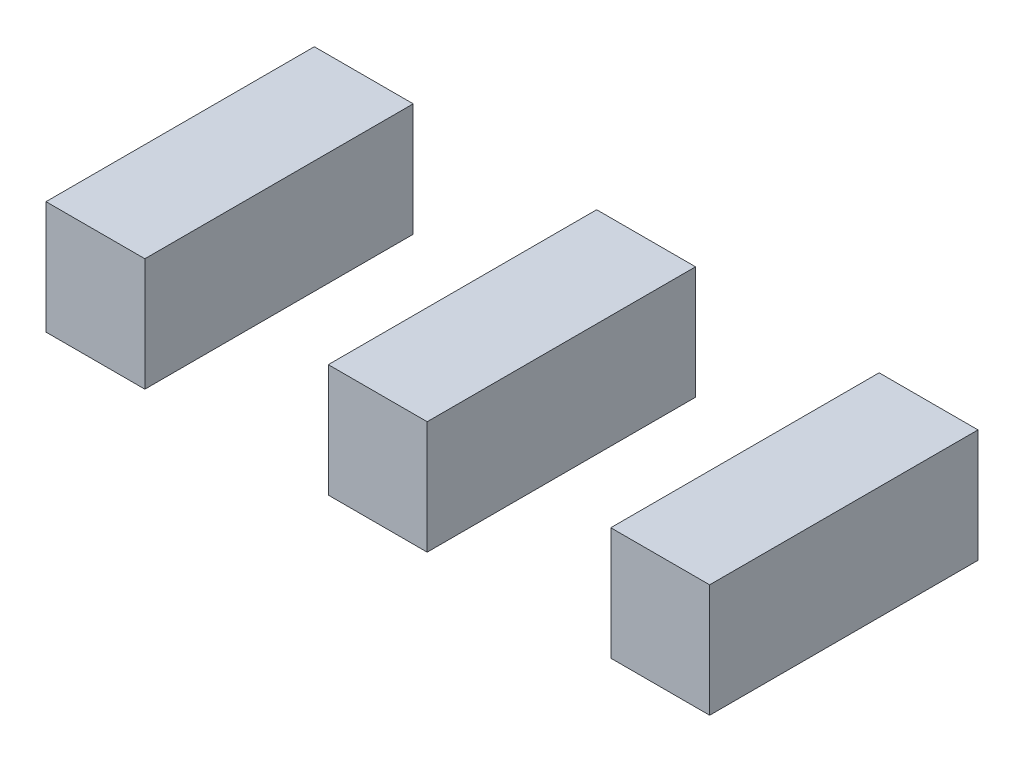
ISO-10303-21;
HEADER;
FILE_DESCRIPTION(('STEP AP214'),'2;1');
FILE_NAME('part.step','',(''),(''),'','','');
FILE_SCHEMA(('AUTOMOTIVE_DESIGN { 1 0 10303 214 1 1 1 1 }'));
ENDSEC;
DATA;
#1=APPLICATION_CONTEXT('core data for automotive mechanical design processes');
#2=APPLICATION_PROTOCOL_DEFINITION('international standard','automotive_design',2000,#1);
#3=PRODUCT_CONTEXT('',#1,'mechanical');
#4=PRODUCT('Part','Part','',(#3));
#5=PRODUCT_RELATED_PRODUCT_CATEGORY('part','',(#4));
#6=PRODUCT_DEFINITION_FORMATION('','',#4);
#7=PRODUCT_DEFINITION_CONTEXT('part definition',#1,'design');
#8=PRODUCT_DEFINITION('design','',#6,#7);
#9=PRODUCT_DEFINITION_SHAPE('','',#8);
#10=(LENGTH_UNIT() NAMED_UNIT(*) SI_UNIT(.MILLI.,.METRE.));
#11=(NAMED_UNIT(*) PLANE_ANGLE_UNIT() SI_UNIT($,.RADIAN.));
#12=(NAMED_UNIT(*) SI_UNIT($,.STERADIAN.) SOLID_ANGLE_UNIT());
#13=UNCERTAINTY_MEASURE_WITH_UNIT(LENGTH_MEASURE(1.E-05),#10,'distance_accuracy_value','');
#14=(GEOMETRIC_REPRESENTATION_CONTEXT(3) GLOBAL_UNCERTAINTY_ASSIGNED_CONTEXT((#13)) GLOBAL_UNIT_ASSIGNED_CONTEXT((#10,
#11,#12)) REPRESENTATION_CONTEXT('',''));
#15=CARTESIAN_POINT('',(0.,0.,0.));
#16=DIRECTION('',(0.,0.,1.));
#17=DIRECTION('',(1.,0.,0.));
#18=AXIS2_PLACEMENT_3D('',#15,#16,#17);
#19=CARTESIAN_POINT('',(-23.4877653852579,8.,-9.49999999999999));
#20=DIRECTION('',(1.,0.,0.));
#21=DIRECTION('',(0.,0.,-1.));
#22=AXIS2_PLACEMENT_3D('',#19,#20,#21);
#23=PLANE('',#22);
#24=DIRECTION('',(0.,0.,1.));
#25=VECTOR('',#24,1.);
#26=CARTESIAN_POINT('',(-23.4877653852579,0.,-9.49999999999999));
#27=LINE('',#26,#25);
#28=CARTESIAN_POINT('',(-23.4877653852579,0.,-9.49999999999999));
#29=VERTEX_POINT('',#28);
#30=CARTESIAN_POINT('',(-23.4877653852579,0.,9.50000000000001));
#31=VERTEX_POINT('',#30);
#32=EDGE_CURVE('E107',#29,#31,#27,.T.);
#33=ORIENTED_EDGE('',*,*,#32,.T.);
#34=DIRECTION('',(0.,-1.,0.));
#35=VECTOR('',#34,1.);
#36=CARTESIAN_POINT('',(-23.4877653852579,8.,9.50000000000001));
#37=LINE('',#36,#35);
#38=CARTESIAN_POINT('',(-23.4877653852579,8.,9.50000000000001));
#39=VERTEX_POINT('',#38);
#40=EDGE_CURVE('E12',#39,#31,#37,.T.);
#41=ORIENTED_EDGE('',*,*,#40,.F.);
#42=DIRECTION('',(0.,0.,1.));
#43=VECTOR('',#42,1.);
#44=CARTESIAN_POINT('',(-23.4877653852579,8.,-9.49999999999999));
#45=LINE('',#44,#43);
#46=CARTESIAN_POINT('',(-23.4877653852579,8.,-9.49999999999999));
#47=VERTEX_POINT('',#46);
#48=EDGE_CURVE('E95',#47,#39,#45,.T.);
#49=ORIENTED_EDGE('',*,*,#48,.F.);
#50=DIRECTION('',(0.,-1.,0.));
#51=VECTOR('',#50,1.);
#52=CARTESIAN_POINT('',(-23.4877653852579,8.,-9.49999999999999));
#53=LINE('',#52,#51);
#54=EDGE_CURVE('E103',#47,#29,#53,.T.);
#55=ORIENTED_EDGE('',*,*,#54,.T.);
#56=EDGE_LOOP('',(#33,#41,#49,#55));
#57=FACE_BOUND('',#56,.T.);
#58=ADVANCED_FACE('F44',(#57),#23,.F.);
#59=CARTESIAN_POINT('',(-16.4877653852579,8.,9.50000000000001));
#60=DIRECTION('',(0.,0.,-1.));
#61=DIRECTION('',(-1.,0.,0.));
#62=AXIS2_PLACEMENT_3D('',#59,#60,#61);
#63=PLANE('',#62);
#64=DIRECTION('',(1.,0.,0.));
#65=VECTOR('',#64,1.);
#66=CARTESIAN_POINT('',(-16.4877653852579,0.,9.50000000000001));
#67=LINE('',#66,#65);
#68=CARTESIAN_POINT('',(-16.4877653852579,0.,9.50000000000001));
#69=VERTEX_POINT('',#68);
#70=EDGE_CURVE('E99',#31,#69,#67,.T.);
#71=ORIENTED_EDGE('',*,*,#70,.T.);
#72=DIRECTION('',(0.,-1.,0.));
#73=VECTOR('',#72,1.);
#74=CARTESIAN_POINT('',(-16.4877653852579,8.,9.50000000000001));
#75=LINE('',#74,#73);
#76=CARTESIAN_POINT('',(-16.4877653852579,8.,9.50000000000001));
#77=VERTEX_POINT('',#76);
#78=EDGE_CURVE('E52',#77,#69,#75,.T.);
#79=ORIENTED_EDGE('',*,*,#78,.F.);
#80=DIRECTION('',(1.,0.,0.));
#81=VECTOR('',#80,1.);
#82=CARTESIAN_POINT('',(-16.4877653852579,8.,9.50000000000001));
#83=LINE('',#82,#81);
#84=EDGE_CURVE('E90',#39,#77,#83,.T.);
#85=ORIENTED_EDGE('',*,*,#84,.F.);
#86=ORIENTED_EDGE('',*,*,#40,.T.);
#87=EDGE_LOOP('',(#71,#79,#85,#86));
#88=FACE_BOUND('',#87,.T.);
#89=ADVANCED_FACE('F98',(#88),#63,.F.);
#90=CARTESIAN_POINT('',(-16.4877653852579,8.,-9.5));
#91=DIRECTION('',(-1.,0.,0.));
#92=DIRECTION('',(0.,0.,1.));
#93=AXIS2_PLACEMENT_3D('',#90,#91,#92);
#94=PLANE('',#93);
#95=DIRECTION('',(0.,0.,-1.));
#96=VECTOR('',#95,1.);
#97=CARTESIAN_POINT('',(-16.4877653852579,0.,-9.5));
#98=LINE('',#97,#96);
#99=CARTESIAN_POINT('',(-16.4877653852579,0.,-9.5));
#100=VERTEX_POINT('',#99);
#101=EDGE_CURVE('E77',#69,#100,#98,.T.);
#102=ORIENTED_EDGE('',*,*,#101,.T.);
#103=DIRECTION('',(0.,-1.,0.));
#104=VECTOR('',#103,1.);
#105=CARTESIAN_POINT('',(-16.4877653852579,8.,-9.5));
#106=LINE('',#105,#104);
#107=CARTESIAN_POINT('',(-16.4877653852579,8.,-9.5));
#108=VERTEX_POINT('',#107);
#109=EDGE_CURVE('E100',#108,#100,#106,.T.);
#110=ORIENTED_EDGE('',*,*,#109,.F.);
#111=DIRECTION('',(0.,0.,-1.));
#112=VECTOR('',#111,1.);
#113=CARTESIAN_POINT('',(-16.4877653852579,8.,-9.5));
#114=LINE('',#113,#112);
#115=EDGE_CURVE('E93',#77,#108,#114,.T.);
#116=ORIENTED_EDGE('',*,*,#115,.F.);
#117=ORIENTED_EDGE('',*,*,#78,.T.);
#118=EDGE_LOOP('',(#102,#110,#116,#117));
#119=FACE_BOUND('',#118,.T.);
#120=ADVANCED_FACE('F101',(#119),#94,.F.);
#121=CARTESIAN_POINT('',(-16.4877653852579,8.,-9.5));
#122=DIRECTION('',(0.,0.,1.));
#123=DIRECTION('',(1.,0.,0.));
#124=AXIS2_PLACEMENT_3D('',#121,#122,#123);
#125=PLANE('',#124);
#126=DIRECTION('',(-1.,0.,0.));
#127=VECTOR('',#126,1.);
#128=CARTESIAN_POINT('',(-16.4877653852579,0.,-9.5));
#129=LINE('',#128,#127);
#130=EDGE_CURVE('E83',#100,#29,#129,.T.);
#131=ORIENTED_EDGE('',*,*,#130,.T.);
#132=ORIENTED_EDGE('',*,*,#54,.F.);
#133=DIRECTION('',(-1.,0.,0.));
#134=VECTOR('',#133,1.);
#135=CARTESIAN_POINT('',(-16.4877653852579,8.,-9.5));
#136=LINE('',#135,#134);
#137=EDGE_CURVE('E60',#108,#47,#136,.T.);
#138=ORIENTED_EDGE('',*,*,#137,.F.);
#139=ORIENTED_EDGE('',*,*,#109,.T.);
#140=EDGE_LOOP('',(#131,#132,#138,#139));
#141=FACE_BOUND('',#140,.T.);
#142=ADVANCED_FACE('F114',(#141),#125,.F.);
#143=CARTESIAN_POINT('',(0.,8.,0.));
#144=DIRECTION('',(0.,-1.,0.));
#145=DIRECTION('',(0.,0.,-1.));
#146=AXIS2_PLACEMENT_3D('',#143,#144,#145);
#147=PLANE('',#146);
#148=ORIENTED_EDGE('',*,*,#48,.T.);
#149=ORIENTED_EDGE('',*,*,#84,.T.);
#150=ORIENTED_EDGE('',*,*,#115,.T.);
#151=ORIENTED_EDGE('',*,*,#137,.T.);
#152=EDGE_LOOP('',(#148,#149,#150,#151));
#153=FACE_BOUND('',#152,.T.);
#154=ADVANCED_FACE('F91',(#153),#147,.F.);
#155=CARTESIAN_POINT('',(0.,0.,0.));
#156=DIRECTION('',(0.,-1.,0.));
#157=DIRECTION('',(0.,0.,-1.));
#158=AXIS2_PLACEMENT_3D('',#155,#156,#157);
#159=PLANE('',#158);
#160=ORIENTED_EDGE('',*,*,#32,.F.);
#161=ORIENTED_EDGE('',*,*,#130,.F.);
#162=ORIENTED_EDGE('',*,*,#101,.F.);
#163=ORIENTED_EDGE('',*,*,#70,.F.);
#164=EDGE_LOOP('',(#160,#161,#162,#163));
#165=FACE_BOUND('',#164,.T.);
#166=ADVANCED_FACE('F117',(#165),#159,.T.);
#167=CLOSED_SHELL('',(#58,#89,#120,#142,#154,#166));
#168=MANIFOLD_SOLID_BREP('B2',#167);
#169=CARTESIAN_POINT('',(23.5,8.,-9.5));
#170=DIRECTION('',(-1.,0.,0.));
#171=DIRECTION('',(0.,0.,1.));
#172=AXIS2_PLACEMENT_3D('',#169,#170,#171);
#173=PLANE('',#172);
#174=DIRECTION('',(0.,0.,-1.));
#175=VECTOR('',#174,1.);
#176=CARTESIAN_POINT('',(23.5,0.,-9.5));
#177=LINE('',#176,#175);
#178=CARTESIAN_POINT('',(23.5,0.,9.5));
#179=VERTEX_POINT('',#178);
#180=CARTESIAN_POINT('',(23.5,0.,-9.5));
#181=VERTEX_POINT('',#180);
#182=EDGE_CURVE('E240',#179,#181,#177,.T.);
#183=ORIENTED_EDGE('',*,*,#182,.T.);
#184=DIRECTION('',(0.,-1.,0.));
#185=VECTOR('',#184,1.);
#186=CARTESIAN_POINT('',(23.5,8.,-9.5));
#187=LINE('',#186,#185);
#188=CARTESIAN_POINT('',(23.5,8.,-9.5));
#189=VERTEX_POINT('',#188);
#190=EDGE_CURVE('E42',#189,#181,#187,.T.);
#191=ORIENTED_EDGE('',*,*,#190,.F.);
#192=DIRECTION('',(0.,0.,-1.));
#193=VECTOR('',#192,1.);
#194=CARTESIAN_POINT('',(23.5,8.,-9.5));
#195=LINE('',#194,#193);
#196=CARTESIAN_POINT('',(23.5,8.,9.5));
#197=VERTEX_POINT('',#196);
#198=EDGE_CURVE('E228',#197,#189,#195,.T.);
#199=ORIENTED_EDGE('',*,*,#198,.F.);
#200=DIRECTION('',(0.,-1.,0.));
#201=VECTOR('',#200,1.);
#202=CARTESIAN_POINT('',(23.5,8.,9.5));
#203=LINE('',#202,#201);
#204=EDGE_CURVE('E236',#197,#179,#203,.T.);
#205=ORIENTED_EDGE('',*,*,#204,.T.);
#206=EDGE_LOOP('',(#183,#191,#199,#205));
#207=FACE_BOUND('',#206,.T.);
#208=ADVANCED_FACE('F177',(#207),#173,.F.);
#209=CARTESIAN_POINT('',(16.5,8.,-9.5));
#210=DIRECTION('',(0.,0.,1.));
#211=DIRECTION('',(1.,0.,0.));
#212=AXIS2_PLACEMENT_3D('',#209,#210,#211);
#213=PLANE('',#212);
#214=DIRECTION('',(-1.,0.,0.));
#215=VECTOR('',#214,1.);
#216=CARTESIAN_POINT('',(16.5,0.,-9.5));
#217=LINE('',#216,#215);
#218=CARTESIAN_POINT('',(16.5,0.,-9.5));
#219=VERTEX_POINT('',#218);
#220=EDGE_CURVE('E232',#181,#219,#217,.T.);
#221=ORIENTED_EDGE('',*,*,#220,.T.);
#222=DIRECTION('',(0.,-1.,0.));
#223=VECTOR('',#222,1.);
#224=CARTESIAN_POINT('',(16.5,8.,-9.5));
#225=LINE('',#224,#223);
#226=CARTESIAN_POINT('',(16.5,8.,-9.5));
#227=VERTEX_POINT('',#226);
#228=EDGE_CURVE('E185',#227,#219,#225,.T.);
#229=ORIENTED_EDGE('',*,*,#228,.F.);
#230=DIRECTION('',(-1.,0.,0.));
#231=VECTOR('',#230,1.);
#232=CARTESIAN_POINT('',(16.5,8.,-9.5));
#233=LINE('',#232,#231);
#234=EDGE_CURVE('E223',#189,#227,#233,.T.);
#235=ORIENTED_EDGE('',*,*,#234,.F.);
#236=ORIENTED_EDGE('',*,*,#190,.T.);
#237=EDGE_LOOP('',(#221,#229,#235,#236));
#238=FACE_BOUND('',#237,.T.);
#239=ADVANCED_FACE('F231',(#238),#213,.F.);
#240=CARTESIAN_POINT('',(16.5,8.,-9.5));
#241=DIRECTION('',(1.,0.,0.));
#242=DIRECTION('',(0.,0.,-1.));
#243=AXIS2_PLACEMENT_3D('',#240,#241,#242);
#244=PLANE('',#243);
#245=DIRECTION('',(0.,0.,1.));
#246=VECTOR('',#245,1.);
#247=CARTESIAN_POINT('',(16.5,0.,-9.5));
#248=LINE('',#247,#246);
#249=CARTESIAN_POINT('',(16.5,0.,9.5));
#250=VERTEX_POINT('',#249);
#251=EDGE_CURVE('E210',#219,#250,#248,.T.);
#252=ORIENTED_EDGE('',*,*,#251,.T.);
#253=DIRECTION('',(0.,-1.,0.));
#254=VECTOR('',#253,1.);
#255=CARTESIAN_POINT('',(16.5,8.,9.5));
#256=LINE('',#255,#254);
#257=CARTESIAN_POINT('',(16.5,8.,9.5));
#258=VERTEX_POINT('',#257);
#259=EDGE_CURVE('E233',#258,#250,#256,.T.);
#260=ORIENTED_EDGE('',*,*,#259,.F.);
#261=DIRECTION('',(0.,0.,1.));
#262=VECTOR('',#261,1.);
#263=CARTESIAN_POINT('',(16.5,8.,-9.5));
#264=LINE('',#263,#262);
#265=EDGE_CURVE('E226',#227,#258,#264,.T.);
#266=ORIENTED_EDGE('',*,*,#265,.F.);
#267=ORIENTED_EDGE('',*,*,#228,.T.);
#268=EDGE_LOOP('',(#252,#260,#266,#267));
#269=FACE_BOUND('',#268,.T.);
#270=ADVANCED_FACE('F234',(#269),#244,.F.);
#271=CARTESIAN_POINT('',(16.5,8.,9.5));
#272=DIRECTION('',(0.,0.,-1.));
#273=DIRECTION('',(-1.,0.,0.));
#274=AXIS2_PLACEMENT_3D('',#271,#272,#273);
#275=PLANE('',#274);
#276=DIRECTION('',(1.,0.,0.));
#277=VECTOR('',#276,1.);
#278=CARTESIAN_POINT('',(16.5,0.,9.5));
#279=LINE('',#278,#277);
#280=EDGE_CURVE('E216',#250,#179,#279,.T.);
#281=ORIENTED_EDGE('',*,*,#280,.T.);
#282=ORIENTED_EDGE('',*,*,#204,.F.);
#283=DIRECTION('',(1.,0.,0.));
#284=VECTOR('',#283,1.);
#285=CARTESIAN_POINT('',(16.5,8.,9.5));
#286=LINE('',#285,#284);
#287=EDGE_CURVE('E193',#258,#197,#286,.T.);
#288=ORIENTED_EDGE('',*,*,#287,.F.);
#289=ORIENTED_EDGE('',*,*,#259,.T.);
#290=EDGE_LOOP('',(#281,#282,#288,#289));
#291=FACE_BOUND('',#290,.T.);
#292=ADVANCED_FACE('F247',(#291),#275,.F.);
#293=CARTESIAN_POINT('',(0.,8.,0.));
#294=DIRECTION('',(0.,1.,0.));
#295=DIRECTION('',(0.,0.,1.));
#296=AXIS2_PLACEMENT_3D('',#293,#294,#295);
#297=PLANE('',#296);
#298=ORIENTED_EDGE('',*,*,#198,.T.);
#299=ORIENTED_EDGE('',*,*,#234,.T.);
#300=ORIENTED_EDGE('',*,*,#265,.T.);
#301=ORIENTED_EDGE('',*,*,#287,.T.);
#302=EDGE_LOOP('',(#298,#299,#300,#301));
#303=FACE_BOUND('',#302,.T.);
#304=ADVANCED_FACE('F224',(#303),#297,.T.);
#305=CARTESIAN_POINT('',(0.,0.,0.));
#306=DIRECTION('',(0.,1.,0.));
#307=DIRECTION('',(0.,0.,1.));
#308=AXIS2_PLACEMENT_3D('',#305,#306,#307);
#309=PLANE('',#308);
#310=ORIENTED_EDGE('',*,*,#182,.F.);
#311=ORIENTED_EDGE('',*,*,#280,.F.);
#312=ORIENTED_EDGE('',*,*,#251,.F.);
#313=ORIENTED_EDGE('',*,*,#220,.F.);
#314=EDGE_LOOP('',(#310,#311,#312,#313));
#315=FACE_BOUND('',#314,.T.);
#316=ADVANCED_FACE('F250',(#315),#309,.F.);
#317=CLOSED_SHELL('',(#208,#239,#270,#292,#304,#316));
#318=MANIFOLD_SOLID_BREP('B6',#317);
#319=CARTESIAN_POINT('',(-3.5,8.,-9.5));
#320=DIRECTION('',(1.,0.,0.));
#321=DIRECTION('',(0.,0.,-1.));
#322=AXIS2_PLACEMENT_3D('',#319,#320,#321);
#323=PLANE('',#322);
#324=DIRECTION('',(0.,0.,1.));
#325=VECTOR('',#324,1.);
#326=CARTESIAN_POINT('',(-3.5,0.,-9.5));
#327=LINE('',#326,#325);
#328=CARTESIAN_POINT('',(-3.5,0.,-9.5));
#329=VERTEX_POINT('',#328);
#330=CARTESIAN_POINT('',(-3.5,0.,9.5));
#331=VERTEX_POINT('',#330);
#332=EDGE_CURVE('E364',#329,#331,#327,.T.);
#333=ORIENTED_EDGE('',*,*,#332,.T.);
#334=DIRECTION('',(0.,-1.,0.));
#335=VECTOR('',#334,1.);
#336=CARTESIAN_POINT('',(-3.5,8.,9.5));
#337=LINE('',#336,#335);
#338=CARTESIAN_POINT('',(-3.5,8.,9.5));
#339=VERTEX_POINT('',#338);
#340=EDGE_CURVE('E175',#339,#331,#337,.T.);
#341=ORIENTED_EDGE('',*,*,#340,.F.);
#342=DIRECTION('',(0.,0.,1.));
#343=VECTOR('',#342,1.);
#344=CARTESIAN_POINT('',(-3.5,8.,-9.5));
#345=LINE('',#344,#343);
#346=CARTESIAN_POINT('',(-3.5,8.,-9.5));
#347=VERTEX_POINT('',#346);
#348=EDGE_CURVE('E352',#347,#339,#345,.T.);
#349=ORIENTED_EDGE('',*,*,#348,.F.);
#350=DIRECTION('',(0.,-1.,0.));
#351=VECTOR('',#350,1.);
#352=CARTESIAN_POINT('',(-3.5,8.,-9.5));
#353=LINE('',#352,#351);
#354=EDGE_CURVE('E360',#347,#329,#353,.T.);
#355=ORIENTED_EDGE('',*,*,#354,.T.);
#356=EDGE_LOOP('',(#333,#341,#349,#355));
#357=FACE_BOUND('',#356,.T.);
#358=ADVANCED_FACE('F301',(#357),#323,.F.);
#359=CARTESIAN_POINT('',(3.5,8.,9.5));
#360=DIRECTION('',(0.,0.,-1.));
#361=DIRECTION('',(-1.,0.,0.));
#362=AXIS2_PLACEMENT_3D('',#359,#360,#361);
#363=PLANE('',#362);
#364=DIRECTION('',(1.,0.,0.));
#365=VECTOR('',#364,1.);
#366=CARTESIAN_POINT('',(3.5,0.,9.5));
#367=LINE('',#366,#365);
#368=CARTESIAN_POINT('',(3.5,0.,9.5));
#369=VERTEX_POINT('',#368);
#370=EDGE_CURVE('E356',#331,#369,#367,.T.);
#371=ORIENTED_EDGE('',*,*,#370,.T.);
#372=DIRECTION('',(0.,-1.,0.));
#373=VECTOR('',#372,1.);
#374=CARTESIAN_POINT('',(3.5,8.,9.5));
#375=LINE('',#374,#373);
#376=CARTESIAN_POINT('',(3.5,8.,9.5));
#377=VERTEX_POINT('',#376);
#378=EDGE_CURVE('E309',#377,#369,#375,.T.);
#379=ORIENTED_EDGE('',*,*,#378,.F.);
#380=DIRECTION('',(1.,0.,0.));
#381=VECTOR('',#380,1.);
#382=CARTESIAN_POINT('',(3.5,8.,9.5));
#383=LINE('',#382,#381);
#384=EDGE_CURVE('E347',#339,#377,#383,.T.);
#385=ORIENTED_EDGE('',*,*,#384,.F.);
#386=ORIENTED_EDGE('',*,*,#340,.T.);
#387=EDGE_LOOP('',(#371,#379,#385,#386));
#388=FACE_BOUND('',#387,.T.);
#389=ADVANCED_FACE('F355',(#388),#363,.F.);
#390=CARTESIAN_POINT('',(3.5,8.,-9.5));
#391=DIRECTION('',(-1.,0.,0.));
#392=DIRECTION('',(0.,0.,1.));
#393=AXIS2_PLACEMENT_3D('',#390,#391,#392);
#394=PLANE('',#393);
#395=DIRECTION('',(0.,0.,-1.));
#396=VECTOR('',#395,1.);
#397=CARTESIAN_POINT('',(3.5,0.,-9.5));
#398=LINE('',#397,#396);
#399=CARTESIAN_POINT('',(3.5,0.,-9.5));
#400=VERTEX_POINT('',#399);
#401=EDGE_CURVE('E334',#369,#400,#398,.T.);
#402=ORIENTED_EDGE('',*,*,#401,.T.);
#403=DIRECTION('',(0.,-1.,0.));
#404=VECTOR('',#403,1.);
#405=CARTESIAN_POINT('',(3.5,8.,-9.5));
#406=LINE('',#405,#404);
#407=CARTESIAN_POINT('',(3.5,8.,-9.5));
#408=VERTEX_POINT('',#407);
#409=EDGE_CURVE('E357',#408,#400,#406,.T.);
#410=ORIENTED_EDGE('',*,*,#409,.F.);
#411=DIRECTION('',(0.,0.,-1.));
#412=VECTOR('',#411,1.);
#413=CARTESIAN_POINT('',(3.5,8.,-9.5));
#414=LINE('',#413,#412);
#415=EDGE_CURVE('E350',#377,#408,#414,.T.);
#416=ORIENTED_EDGE('',*,*,#415,.F.);
#417=ORIENTED_EDGE('',*,*,#378,.T.);
#418=EDGE_LOOP('',(#402,#410,#416,#417));
#419=FACE_BOUND('',#418,.T.);
#420=ADVANCED_FACE('F358',(#419),#394,.F.);
#421=CARTESIAN_POINT('',(3.5,8.,-9.5));
#422=DIRECTION('',(0.,0.,1.));
#423=DIRECTION('',(1.,0.,0.));
#424=AXIS2_PLACEMENT_3D('',#421,#422,#423);
#425=PLANE('',#424);
#426=DIRECTION('',(-1.,0.,0.));
#427=VECTOR('',#426,1.);
#428=CARTESIAN_POINT('',(3.5,0.,-9.5));
#429=LINE('',#428,#427);
#430=EDGE_CURVE('E340',#400,#329,#429,.T.);
#431=ORIENTED_EDGE('',*,*,#430,.T.);
#432=ORIENTED_EDGE('',*,*,#354,.F.);
#433=DIRECTION('',(-1.,0.,0.));
#434=VECTOR('',#433,1.);
#435=CARTESIAN_POINT('',(3.5,8.,-9.5));
#436=LINE('',#435,#434);
#437=EDGE_CURVE('E317',#408,#347,#436,.T.);
#438=ORIENTED_EDGE('',*,*,#437,.F.);
#439=ORIENTED_EDGE('',*,*,#409,.T.);
#440=EDGE_LOOP('',(#431,#432,#438,#439));
#441=FACE_BOUND('',#440,.T.);
#442=ADVANCED_FACE('F371',(#441),#425,.F.);
#443=CARTESIAN_POINT('',(0.,8.,0.));
#444=DIRECTION('',(0.,-1.,0.));
#445=DIRECTION('',(0.,0.,-1.));
#446=AXIS2_PLACEMENT_3D('',#443,#444,#445);
#447=PLANE('',#446);
#448=ORIENTED_EDGE('',*,*,#348,.T.);
#449=ORIENTED_EDGE('',*,*,#384,.T.);
#450=ORIENTED_EDGE('',*,*,#415,.T.);
#451=ORIENTED_EDGE('',*,*,#437,.T.);
#452=EDGE_LOOP('',(#448,#449,#450,#451));
#453=FACE_BOUND('',#452,.T.);
#454=ADVANCED_FACE('F348',(#453),#447,.F.);
#455=CARTESIAN_POINT('',(0.,0.,0.));
#456=DIRECTION('',(0.,-1.,0.));
#457=DIRECTION('',(0.,0.,-1.));
#458=AXIS2_PLACEMENT_3D('',#455,#456,#457);
#459=PLANE('',#458);
#460=ORIENTED_EDGE('',*,*,#332,.F.);
#461=ORIENTED_EDGE('',*,*,#430,.F.);
#462=ORIENTED_EDGE('',*,*,#401,.F.);
#463=ORIENTED_EDGE('',*,*,#370,.F.);
#464=EDGE_LOOP('',(#460,#461,#462,#463));
#465=FACE_BOUND('',#464,.T.);
#466=ADVANCED_FACE('F374',(#465),#459,.T.);
#467=CLOSED_SHELL('',(#358,#389,#420,#442,#454,#466));
#468=MANIFOLD_SOLID_BREP('B36',#467);
#469=ADVANCED_BREP_SHAPE_REPRESENTATION('',(#18,#168,#318,#468),#14);
#470=SHAPE_DEFINITION_REPRESENTATION(#9,#469);
ENDSEC;
END-ISO-10303-21;
